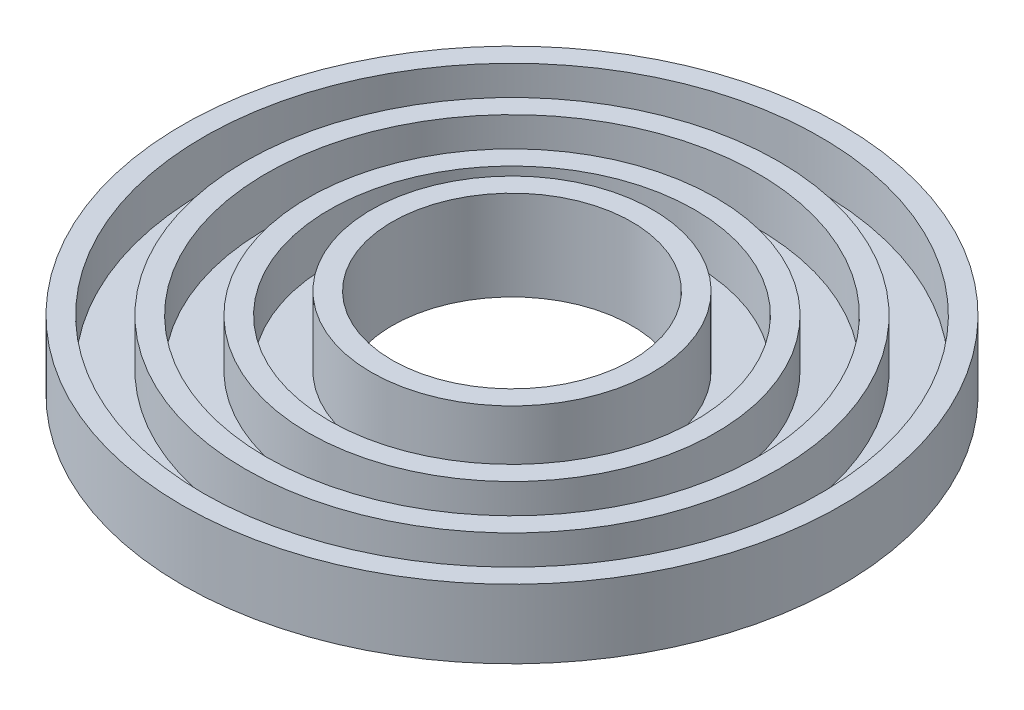
ISO-10303-21;
HEADER;
FILE_DESCRIPTION(('STEP AP214'),'2;1');
FILE_NAME('part.step','',(''),(''),'','','');
FILE_SCHEMA(('AUTOMOTIVE_DESIGN { 1 0 10303 214 1 1 1 1 }'));
ENDSEC;
DATA;
#1=APPLICATION_CONTEXT('core data for automotive mechanical design processes');
#2=APPLICATION_PROTOCOL_DEFINITION('international standard','automotive_design',2000,#1);
#3=PRODUCT_CONTEXT('',#1,'mechanical');
#4=PRODUCT('Part','Part','',(#3));
#5=PRODUCT_RELATED_PRODUCT_CATEGORY('part','',(#4));
#6=PRODUCT_DEFINITION_FORMATION('','',#4);
#7=PRODUCT_DEFINITION_CONTEXT('part definition',#1,'design');
#8=PRODUCT_DEFINITION('design','',#6,#7);
#9=PRODUCT_DEFINITION_SHAPE('','',#8);
#10=(LENGTH_UNIT() NAMED_UNIT(*) SI_UNIT(.MILLI.,.METRE.));
#11=(NAMED_UNIT(*) PLANE_ANGLE_UNIT() SI_UNIT($,.RADIAN.));
#12=(NAMED_UNIT(*) SI_UNIT($,.STERADIAN.) SOLID_ANGLE_UNIT());
#13=UNCERTAINTY_MEASURE_WITH_UNIT(LENGTH_MEASURE(1.E-05),#10,'distance_accuracy_value','');
#14=(GEOMETRIC_REPRESENTATION_CONTEXT(3) GLOBAL_UNCERTAINTY_ASSIGNED_CONTEXT((#13)) GLOBAL_UNIT_ASSIGNED_CONTEXT((#10,
#11,#12)) REPRESENTATION_CONTEXT('',''));
#15=CARTESIAN_POINT('',(0.,0.,0.));
#16=DIRECTION('',(0.,0.,1.));
#17=DIRECTION('',(1.,0.,0.));
#18=AXIS2_PLACEMENT_3D('',#15,#16,#17);
#19=CARTESIAN_POINT('',(0.,0.7,0.));
#20=DIRECTION('',(0.,1.,0.));
#21=DIRECTION('',(0.,0.,1.));
#22=AXIS2_PLACEMENT_3D('',#19,#20,#21);
#23=PLANE('',#22);
#24=CARTESIAN_POINT('',(0.,0.7,0.));
#25=DIRECTION('',(0.,1.,0.));
#26=DIRECTION('',(0.,0.,1.));
#27=AXIS2_PLACEMENT_3D('',#24,#25,#26);
#28=CIRCLE('',#27,6.1);
#29=CARTESIAN_POINT('',(0.,0.7,6.1));
#30=VERTEX_POINT('',#29);
#31=EDGE_CURVE('E12',#30,#30,#28,.F.);
#32=ORIENTED_EDGE('',*,*,#31,.F.);
#33=EDGE_LOOP('',(#32));
#34=FACE_BOUND('',#33,.T.);
#35=CARTESIAN_POINT('',(0.,0.7,0.));
#36=DIRECTION('',(0.,1.,0.));
#37=DIRECTION('',(0.,0.,1.));
#38=AXIS2_PLACEMENT_3D('',#35,#36,#37);
#39=CIRCLE('',#38,4.7);
#40=CARTESIAN_POINT('',(0.,0.7,4.7));
#41=VERTEX_POINT('',#40);
#42=EDGE_CURVE('E110',#41,#41,#39,.T.);
#43=ORIENTED_EDGE('',*,*,#42,.F.);
#44=EDGE_LOOP('',(#43));
#45=FACE_BOUND('',#44,.T.);
#46=ADVANCED_FACE('F67',(#34,#45),#23,.T.);
#47=CARTESIAN_POINT('',(0.,0.7,0.));
#48=DIRECTION('',(0.,1.,0.));
#49=DIRECTION('',(0.,0.,1.));
#50=AXIS2_PLACEMENT_3D('',#47,#48,#49);
#51=CIRCLE('',#50,8.2);
#52=CARTESIAN_POINT('',(0.,0.7,8.2));
#53=VERTEX_POINT('',#52);
#54=EDGE_CURVE('E74',#53,#53,#51,.F.);
#55=ORIENTED_EDGE('',*,*,#54,.F.);
#56=EDGE_LOOP('',(#55));
#57=FACE_BOUND('',#56,.T.);
#58=CARTESIAN_POINT('',(0.,0.7,0.));
#59=DIRECTION('',(0.,1.,0.));
#60=DIRECTION('',(0.,0.,1.));
#61=AXIS2_PLACEMENT_3D('',#58,#59,#60);
#62=CIRCLE('',#61,6.8);
#63=CARTESIAN_POINT('',(0.,0.7,6.8));
#64=VERTEX_POINT('',#63);
#65=EDGE_CURVE('E106',#64,#64,#62,.T.);
#66=ORIENTED_EDGE('',*,*,#65,.F.);
#67=EDGE_LOOP('',(#66));
#68=FACE_BOUND('',#67,.T.);
#69=ADVANCED_FACE('F141',(#57,#68),#23,.T.);
#70=CARTESIAN_POINT('',(0.,0.7,0.));
#71=DIRECTION('',(0.,1.,0.));
#72=DIRECTION('',(0.,0.,1.));
#73=AXIS2_PLACEMENT_3D('',#70,#71,#72);
#74=CIRCLE('',#73,10.3);
#75=CARTESIAN_POINT('',(0.,0.7,10.3));
#76=VERTEX_POINT('',#75);
#77=EDGE_CURVE('E78',#76,#76,#74,.F.);
#78=ORIENTED_EDGE('',*,*,#77,.F.);
#79=EDGE_LOOP('',(#78));
#80=FACE_BOUND('',#79,.T.);
#81=CARTESIAN_POINT('',(0.,0.7,0.));
#82=DIRECTION('',(0.,1.,0.));
#83=DIRECTION('',(0.,0.,1.));
#84=AXIS2_PLACEMENT_3D('',#81,#82,#83);
#85=CIRCLE('',#84,8.9);
#86=CARTESIAN_POINT('',(0.,0.7,8.9));
#87=VERTEX_POINT('',#86);
#88=EDGE_CURVE('E97',#87,#87,#85,.T.);
#89=ORIENTED_EDGE('',*,*,#88,.F.);
#90=EDGE_LOOP('',(#89));
#91=FACE_BOUND('',#90,.T.);
#92=ADVANCED_FACE('F144',(#80,#91),#23,.T.);
#93=CARTESIAN_POINT('',(0.,0.,0.));
#94=DIRECTION('',(0.,1.,0.));
#95=DIRECTION('',(0.,0.,1.));
#96=AXIS2_PLACEMENT_3D('',#93,#94,#95);
#97=PLANE('',#96);
#98=CARTESIAN_POINT('',(0.,0.,0.));
#99=DIRECTION('',(0.,1.,0.));
#100=DIRECTION('',(0.,0.,1.));
#101=AXIS2_PLACEMENT_3D('',#98,#99,#100);
#102=CIRCLE('',#101,11.);
#103=CARTESIAN_POINT('',(0.,0.,11.));
#104=VERTEX_POINT('',#103);
#105=EDGE_CURVE('E82',#104,#104,#102,.T.);
#106=ORIENTED_EDGE('',*,*,#105,.F.);
#107=EDGE_LOOP('',(#106));
#108=FACE_BOUND('',#107,.T.);
#109=CARTESIAN_POINT('',(0.,0.,0.));
#110=DIRECTION('',(0.,1.,0.));
#111=DIRECTION('',(0.,0.,1.));
#112=AXIS2_PLACEMENT_3D('',#109,#110,#111);
#113=CIRCLE('',#112,4.);
#114=CARTESIAN_POINT('',(0.,0.,4.));
#115=VERTEX_POINT('',#114);
#116=EDGE_CURVE('E87',#115,#115,#113,.T.);
#117=ORIENTED_EDGE('',*,*,#116,.T.);
#118=EDGE_LOOP('',(#117));
#119=FACE_BOUND('',#118,.T.);
#120=ADVANCED_FACE('F152',(#108,#119),#97,.F.);
#121=CARTESIAN_POINT('',(0.,0.7,0.));
#122=DIRECTION('',(0.,-1.,0.));
#123=DIRECTION('',(0.,0.,-1.));
#124=AXIS2_PLACEMENT_3D('',#121,#122,#123);
#125=CYLINDRICAL_SURFACE('',#124,11.);
#126=ORIENTED_EDGE('',*,*,#105,.T.);
#127=EDGE_LOOP('',(#126));
#128=FACE_BOUND('',#127,.T.);
#129=CARTESIAN_POINT('',(0.,2.3,0.));
#130=DIRECTION('',(0.,1.,0.));
#131=DIRECTION('',(0.,0.,1.));
#132=AXIS2_PLACEMENT_3D('',#129,#130,#131);
#133=CIRCLE('',#132,11.);
#134=CARTESIAN_POINT('',(0.,2.3,11.));
#135=VERTEX_POINT('',#134);
#136=EDGE_CURVE('E90',#135,#135,#133,.T.);
#137=ORIENTED_EDGE('',*,*,#136,.F.);
#138=EDGE_LOOP('',(#137));
#139=FACE_BOUND('',#138,.T.);
#140=ADVANCED_FACE('F69',(#128,#139),#125,.T.);
#141=CARTESIAN_POINT('',(0.,0.7,0.));
#142=DIRECTION('',(0.,-1.,0.));
#143=DIRECTION('',(0.,0.,-1.));
#144=AXIS2_PLACEMENT_3D('',#141,#142,#143);
#145=CYLINDRICAL_SURFACE('',#144,4.);
#146=ORIENTED_EDGE('',*,*,#116,.F.);
#147=EDGE_LOOP('',(#146));
#148=FACE_BOUND('',#147,.T.);
#149=CARTESIAN_POINT('',(0.,3.,0.));
#150=DIRECTION('',(0.,1.,0.));
#151=DIRECTION('',(0.,0.,1.));
#152=AXIS2_PLACEMENT_3D('',#149,#150,#151);
#153=CIRCLE('',#152,4.);
#154=CARTESIAN_POINT('',(0.,3.,4.));
#155=VERTEX_POINT('',#154);
#156=EDGE_CURVE('E118',#155,#155,#153,.T.);
#157=ORIENTED_EDGE('',*,*,#156,.T.);
#158=EDGE_LOOP('',(#157));
#159=FACE_BOUND('',#158,.T.);
#160=ADVANCED_FACE('F186',(#148,#159),#145,.F.);
#161=CARTESIAN_POINT('',(0.,2.3,0.));
#162=DIRECTION('',(0.,-1.,0.));
#163=DIRECTION('',(0.,0.,-1.));
#164=AXIS2_PLACEMENT_3D('',#161,#162,#163);
#165=CYLINDRICAL_SURFACE('',#164,10.3);
#166=CARTESIAN_POINT('',(0.,2.3,0.));
#167=DIRECTION('',(0.,1.,0.));
#168=DIRECTION('',(0.,0.,1.));
#169=AXIS2_PLACEMENT_3D('',#166,#167,#168);
#170=CIRCLE('',#169,10.3);
#171=CARTESIAN_POINT('',(0.,2.3,10.3));
#172=VERTEX_POINT('',#171);
#173=EDGE_CURVE('E93',#172,#172,#170,.T.);
#174=ORIENTED_EDGE('',*,*,#173,.T.);
#175=EDGE_LOOP('',(#174));
#176=FACE_BOUND('',#175,.T.);
#177=ORIENTED_EDGE('',*,*,#77,.T.);
#178=EDGE_LOOP('',(#177));
#179=FACE_BOUND('',#178,.T.);
#180=ADVANCED_FACE('F183',(#176,#179),#165,.F.);
#181=CARTESIAN_POINT('',(-24.3414213562373,2.3,0.));
#182=DIRECTION('',(0.,1.,0.));
#183=DIRECTION('',(0.,0.,1.));
#184=AXIS2_PLACEMENT_3D('',#181,#182,#183);
#185=PLANE('',#184);
#186=ORIENTED_EDGE('',*,*,#173,.F.);
#187=EDGE_LOOP('',(#186));
#188=FACE_BOUND('',#187,.T.);
#189=ORIENTED_EDGE('',*,*,#136,.T.);
#190=EDGE_LOOP('',(#189));
#191=FACE_BOUND('',#190,.T.);
#192=ADVANCED_FACE('F175',(#188,#191),#185,.T.);
#193=CARTESIAN_POINT('',(0.,2.3,0.));
#194=DIRECTION('',(0.,-1.,0.));
#195=DIRECTION('',(0.,0.,-1.));
#196=AXIS2_PLACEMENT_3D('',#193,#194,#195);
#197=CYLINDRICAL_SURFACE('',#196,8.2);
#198=CARTESIAN_POINT('',(0.,2.3,0.));
#199=DIRECTION('',(0.,1.,0.));
#200=DIRECTION('',(0.,0.,1.));
#201=AXIS2_PLACEMENT_3D('',#198,#199,#200);
#202=CIRCLE('',#201,8.2);
#203=CARTESIAN_POINT('',(0.,2.3,8.2));
#204=VERTEX_POINT('',#203);
#205=EDGE_CURVE('E100',#204,#204,#202,.T.);
#206=ORIENTED_EDGE('',*,*,#205,.T.);
#207=EDGE_LOOP('',(#206));
#208=FACE_BOUND('',#207,.T.);
#209=ORIENTED_EDGE('',*,*,#54,.T.);
#210=EDGE_LOOP('',(#209));
#211=FACE_BOUND('',#210,.T.);
#212=ADVANCED_FACE('F165',(#208,#211),#197,.F.);
#213=CARTESIAN_POINT('',(0.,2.3,0.));
#214=DIRECTION('',(0.,-1.,0.));
#215=DIRECTION('',(0.,0.,-1.));
#216=AXIS2_PLACEMENT_3D('',#213,#214,#215);
#217=CYLINDRICAL_SURFACE('',#216,8.9);
#218=CARTESIAN_POINT('',(0.,2.3,0.));
#219=DIRECTION('',(0.,1.,0.));
#220=DIRECTION('',(0.,0.,1.));
#221=AXIS2_PLACEMENT_3D('',#218,#219,#220);
#222=CIRCLE('',#221,8.9);
#223=CARTESIAN_POINT('',(0.,2.3,8.9));
#224=VERTEX_POINT('',#223);
#225=EDGE_CURVE('E96',#224,#224,#222,.T.);
#226=ORIENTED_EDGE('',*,*,#225,.F.);
#227=EDGE_LOOP('',(#226));
#228=FACE_BOUND('',#227,.T.);
#229=ORIENTED_EDGE('',*,*,#88,.T.);
#230=EDGE_LOOP('',(#229));
#231=FACE_BOUND('',#230,.T.);
#232=ADVANCED_FACE('F162',(#228,#231),#217,.T.);
#233=CARTESIAN_POINT('',(-24.3414213562373,2.3,0.));
#234=DIRECTION('',(0.,1.,0.));
#235=DIRECTION('',(0.,0.,1.));
#236=AXIS2_PLACEMENT_3D('',#233,#234,#235);
#237=PLANE('',#236);
#238=ORIENTED_EDGE('',*,*,#205,.F.);
#239=EDGE_LOOP('',(#238));
#240=FACE_BOUND('',#239,.T.);
#241=ORIENTED_EDGE('',*,*,#225,.T.);
#242=EDGE_LOOP('',(#241));
#243=FACE_BOUND('',#242,.T.);
#244=ADVANCED_FACE('F164',(#240,#243),#237,.T.);
#245=CARTESIAN_POINT('',(0.,2.3,0.));
#246=DIRECTION('',(0.,-1.,0.));
#247=DIRECTION('',(0.,0.,-1.));
#248=AXIS2_PLACEMENT_3D('',#245,#246,#247);
#249=CYLINDRICAL_SURFACE('',#248,6.1);
#250=CARTESIAN_POINT('',(0.,2.3,0.));
#251=DIRECTION('',(0.,1.,0.));
#252=DIRECTION('',(0.,0.,1.));
#253=AXIS2_PLACEMENT_3D('',#250,#251,#252);
#254=CIRCLE('',#253,6.1);
#255=CARTESIAN_POINT('',(0.,2.3,6.1));
#256=VERTEX_POINT('',#255);
#257=EDGE_CURVE('E109',#256,#256,#254,.T.);
#258=ORIENTED_EDGE('',*,*,#257,.T.);
#259=EDGE_LOOP('',(#258));
#260=FACE_BOUND('',#259,.T.);
#261=ORIENTED_EDGE('',*,*,#31,.T.);
#262=EDGE_LOOP('',(#261));
#263=FACE_BOUND('',#262,.T.);
#264=ADVANCED_FACE('F172',(#260,#263),#249,.F.);
#265=CARTESIAN_POINT('',(0.,2.3,0.));
#266=DIRECTION('',(0.,-1.,0.));
#267=DIRECTION('',(0.,0.,-1.));
#268=AXIS2_PLACEMENT_3D('',#265,#266,#267);
#269=CYLINDRICAL_SURFACE('',#268,6.8);
#270=CARTESIAN_POINT('',(0.,2.3,0.));
#271=DIRECTION('',(0.,1.,0.));
#272=DIRECTION('',(0.,0.,1.));
#273=AXIS2_PLACEMENT_3D('',#270,#271,#272);
#274=CIRCLE('',#273,6.8);
#275=CARTESIAN_POINT('',(0.,2.3,6.8));
#276=VERTEX_POINT('',#275);
#277=EDGE_CURVE('E101',#276,#276,#274,.T.);
#278=ORIENTED_EDGE('',*,*,#277,.F.);
#279=EDGE_LOOP('',(#278));
#280=FACE_BOUND('',#279,.T.);
#281=ORIENTED_EDGE('',*,*,#65,.T.);
#282=EDGE_LOOP('',(#281));
#283=FACE_BOUND('',#282,.T.);
#284=ADVANCED_FACE('F137',(#280,#283),#269,.T.);
#285=CARTESIAN_POINT('',(-24.3414213562373,2.3,0.));
#286=DIRECTION('',(0.,1.,0.));
#287=DIRECTION('',(0.,0.,1.));
#288=AXIS2_PLACEMENT_3D('',#285,#286,#287);
#289=PLANE('',#288);
#290=ORIENTED_EDGE('',*,*,#257,.F.);
#291=EDGE_LOOP('',(#290));
#292=FACE_BOUND('',#291,.T.);
#293=ORIENTED_EDGE('',*,*,#277,.T.);
#294=EDGE_LOOP('',(#293));
#295=FACE_BOUND('',#294,.T.);
#296=ADVANCED_FACE('F128',(#292,#295),#289,.T.);
#297=CARTESIAN_POINT('',(0.,2.3,0.));
#298=DIRECTION('',(0.,-1.,0.));
#299=DIRECTION('',(0.,0.,-1.));
#300=AXIS2_PLACEMENT_3D('',#297,#298,#299);
#301=CYLINDRICAL_SURFACE('',#300,4.7);
#302=ORIENTED_EDGE('',*,*,#42,.T.);
#303=EDGE_LOOP('',(#302));
#304=FACE_BOUND('',#303,.T.);
#305=CARTESIAN_POINT('',(0.,3.,0.));
#306=DIRECTION('',(0.,1.,0.));
#307=DIRECTION('',(0.,0.,1.));
#308=AXIS2_PLACEMENT_3D('',#305,#306,#307);
#309=CIRCLE('',#308,4.7);
#310=CARTESIAN_POINT('',(0.,3.,4.7));
#311=VERTEX_POINT('',#310);
#312=EDGE_CURVE('E117',#311,#311,#309,.T.);
#313=ORIENTED_EDGE('',*,*,#312,.F.);
#314=EDGE_LOOP('',(#313));
#315=FACE_BOUND('',#314,.T.);
#316=ADVANCED_FACE('F126',(#304,#315),#301,.T.);
#317=CARTESIAN_POINT('',(0.,3.,0.));
#318=DIRECTION('',(0.,1.,0.));
#319=DIRECTION('',(0.,0.,1.));
#320=AXIS2_PLACEMENT_3D('',#317,#318,#319);
#321=PLANE('',#320);
#322=ORIENTED_EDGE('',*,*,#156,.F.);
#323=EDGE_LOOP('',(#322));
#324=FACE_BOUND('',#323,.T.);
#325=ORIENTED_EDGE('',*,*,#312,.T.);
#326=EDGE_LOOP('',(#325));
#327=FACE_BOUND('',#326,.T.);
#328=ADVANCED_FACE('F124',(#324,#327),#321,.T.);
#329=CLOSED_SHELL('',(#46,#69,#92,#120,#140,#160,#180,#192,#212,#232,#244,#264,#284,#296,#316,#328));
#330=MANIFOLD_SOLID_BREP('B2',#329);
#331=ADVANCED_BREP_SHAPE_REPRESENTATION('',(#18,#330),#14);
#332=SHAPE_DEFINITION_REPRESENTATION(#9,#331);
ENDSEC;
END-ISO-10303-21;
